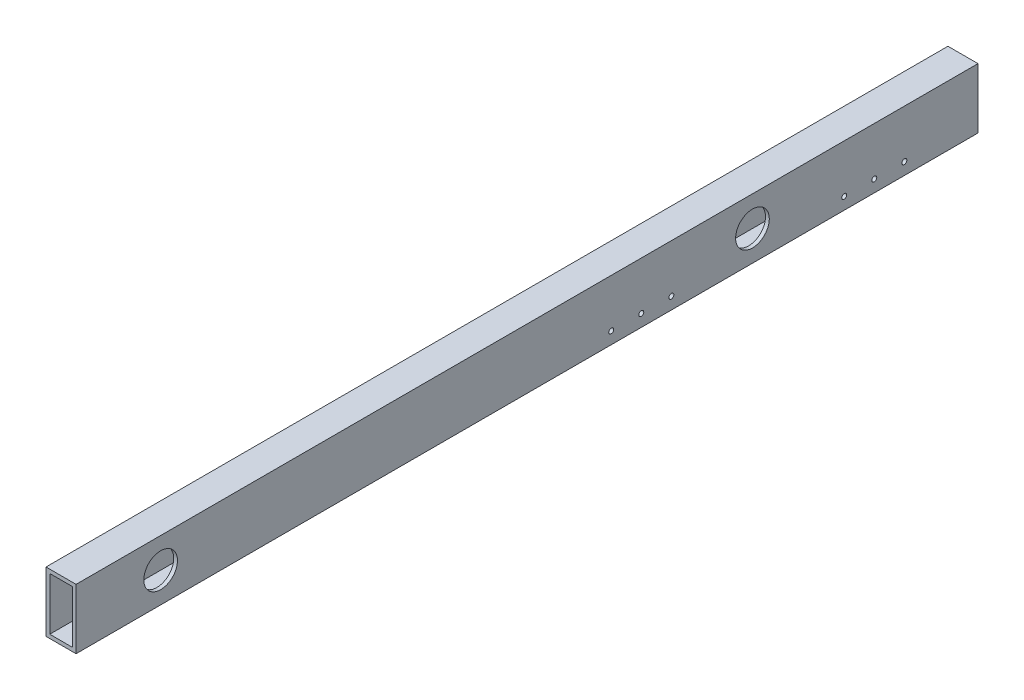
ISO-10303-21;
HEADER;
FILE_DESCRIPTION(('STEP AP214'),'2;1');
FILE_NAME('part.step','',(''),(''),'','','');
FILE_SCHEMA(('AUTOMOTIVE_DESIGN { 1 0 10303 214 1 1 1 1 }'));
ENDSEC;
DATA;
#1=APPLICATION_CONTEXT('core data for automotive mechanical design processes');
#2=APPLICATION_PROTOCOL_DEFINITION('international standard','automotive_design',2000,#1);
#3=PRODUCT_CONTEXT('',#1,'mechanical');
#4=PRODUCT('Part','Part','',(#3));
#5=PRODUCT_RELATED_PRODUCT_CATEGORY('part','',(#4));
#6=PRODUCT_DEFINITION_FORMATION('','',#4);
#7=PRODUCT_DEFINITION_CONTEXT('part definition',#1,'design');
#8=PRODUCT_DEFINITION('design','',#6,#7);
#9=PRODUCT_DEFINITION_SHAPE('','',#8);
#10=(LENGTH_UNIT() NAMED_UNIT(*) SI_UNIT(.MILLI.,.METRE.));
#11=(NAMED_UNIT(*) PLANE_ANGLE_UNIT() SI_UNIT($,.RADIAN.));
#12=(NAMED_UNIT(*) SI_UNIT($,.STERADIAN.) SOLID_ANGLE_UNIT());
#13=UNCERTAINTY_MEASURE_WITH_UNIT(LENGTH_MEASURE(1.E-05),#10,'distance_accuracy_value','');
#14=(GEOMETRIC_REPRESENTATION_CONTEXT(3) GLOBAL_UNCERTAINTY_ASSIGNED_CONTEXT((#13)) GLOBAL_UNIT_ASSIGNED_CONTEXT((#10,
#11,#12)) REPRESENTATION_CONTEXT('',''));
#15=CARTESIAN_POINT('',(0.,0.,0.));
#16=DIRECTION('',(0.,0.,1.));
#17=DIRECTION('',(1.,0.,0.));
#18=AXIS2_PLACEMENT_3D('',#15,#16,#17);
#19=CARTESIAN_POINT('',(0.,0.,762.));
#20=DIRECTION('',(0.,0.,1.));
#21=DIRECTION('',(1.,0.,0.));
#22=AXIS2_PLACEMENT_3D('',#19,#20,#21);
#23=PLANE('',#22);
#24=DIRECTION('',(0.,1.,0.));
#25=VECTOR('',#24,1.);
#26=CARTESIAN_POINT('',(12.7,25.4,762.));
#27=LINE('',#26,#25);
#28=CARTESIAN_POINT('',(12.7,-25.4,762.));
#29=VERTEX_POINT('',#28);
#30=CARTESIAN_POINT('',(12.7,25.4,762.));
#31=VERTEX_POINT('',#30);
#32=EDGE_CURVE('E157',#29,#31,#27,.T.);
#33=ORIENTED_EDGE('',*,*,#32,.T.);
#34=DIRECTION('',(-1.,0.,0.));
#35=VECTOR('',#34,1.);
#36=CARTESIAN_POINT('',(-12.7,25.4,762.));
#37=LINE('',#36,#35);
#38=CARTESIAN_POINT('',(-12.7,25.4,762.));
#39=VERTEX_POINT('',#38);
#40=EDGE_CURVE('E161',#31,#39,#37,.T.);
#41=ORIENTED_EDGE('',*,*,#40,.T.);
#42=DIRECTION('',(0.,-1.,0.));
#43=VECTOR('',#42,1.);
#44=CARTESIAN_POINT('',(-12.7,25.4,762.));
#45=LINE('',#44,#43);
#46=CARTESIAN_POINT('',(-12.7,-25.4,762.));
#47=VERTEX_POINT('',#46);
#48=EDGE_CURVE('E165',#39,#47,#45,.T.);
#49=ORIENTED_EDGE('',*,*,#48,.T.);
#50=DIRECTION('',(1.,0.,0.));
#51=VECTOR('',#50,1.);
#52=CARTESIAN_POINT('',(-12.7,-25.4,762.));
#53=LINE('',#52,#51);
#54=EDGE_CURVE('E168',#47,#29,#53,.T.);
#55=ORIENTED_EDGE('',*,*,#54,.T.);
#56=EDGE_LOOP('',(#33,#41,#49,#55));
#57=FACE_BOUND('',#56,.T.);
#58=DIRECTION('',(1.,0.,0.));
#59=VECTOR('',#58,1.);
#60=CARTESIAN_POINT('',(-9.525,-22.225,762.));
#61=LINE('',#60,#59);
#62=CARTESIAN_POINT('',(-9.525,-22.225,762.));
#63=VERTEX_POINT('',#62);
#64=CARTESIAN_POINT('',(9.52500000000002,-22.225,762.));
#65=VERTEX_POINT('',#64);
#66=EDGE_CURVE('E116',#63,#65,#61,.T.);
#67=ORIENTED_EDGE('',*,*,#66,.F.);
#68=DIRECTION('',(0.,-1.,0.));
#69=VECTOR('',#68,1.);
#70=CARTESIAN_POINT('',(-9.52500000000001,22.225,762.));
#71=LINE('',#70,#69);
#72=CARTESIAN_POINT('',(-9.52500000000001,22.225,762.));
#73=VERTEX_POINT('',#72);
#74=EDGE_CURVE('E107',#73,#63,#71,.T.);
#75=ORIENTED_EDGE('',*,*,#74,.F.);
#76=DIRECTION('',(-1.,0.,0.));
#77=VECTOR('',#76,1.);
#78=CARTESIAN_POINT('',(-9.52500000000001,22.225,762.));
#79=LINE('',#78,#77);
#80=CARTESIAN_POINT('',(9.52500000000001,22.225,762.));
#81=VERTEX_POINT('',#80);
#82=EDGE_CURVE('E133',#81,#73,#79,.T.);
#83=ORIENTED_EDGE('',*,*,#82,.F.);
#84=DIRECTION('',(0.,1.,0.));
#85=VECTOR('',#84,1.);
#86=CARTESIAN_POINT('',(9.52500000000001,22.225,762.));
#87=LINE('',#86,#85);
#88=EDGE_CURVE('E129',#65,#81,#87,.T.);
#89=ORIENTED_EDGE('',*,*,#88,.F.);
#90=EDGE_LOOP('',(#67,#75,#83,#89));
#91=FACE_BOUND('',#90,.T.);
#92=ADVANCED_FACE('F39',(#57,#91),#23,.T.);
#93=CARTESIAN_POINT('',(0.,0.,0.));
#94=DIRECTION('',(0.,0.,1.));
#95=DIRECTION('',(1.,0.,0.));
#96=AXIS2_PLACEMENT_3D('',#93,#94,#95);
#97=PLANE('',#96);
#98=DIRECTION('',(0.,1.,0.));
#99=VECTOR('',#98,1.);
#100=CARTESIAN_POINT('',(12.7,25.4,0.));
#101=LINE('',#100,#99);
#102=CARTESIAN_POINT('',(12.7,-25.4,0.));
#103=VERTEX_POINT('',#102);
#104=CARTESIAN_POINT('',(12.7,25.4,0.));
#105=VERTEX_POINT('',#104);
#106=EDGE_CURVE('E125',#103,#105,#101,.T.);
#107=ORIENTED_EDGE('',*,*,#106,.F.);
#108=DIRECTION('',(1.,0.,0.));
#109=VECTOR('',#108,1.);
#110=CARTESIAN_POINT('',(-12.7,-25.4,0.));
#111=LINE('',#110,#109);
#112=CARTESIAN_POINT('',(-12.7,-25.4,0.));
#113=VERTEX_POINT('',#112);
#114=EDGE_CURVE('E162',#113,#103,#111,.T.);
#115=ORIENTED_EDGE('',*,*,#114,.F.);
#116=DIRECTION('',(0.,-1.,0.));
#117=VECTOR('',#116,1.);
#118=CARTESIAN_POINT('',(-12.7,25.4,0.));
#119=LINE('',#118,#117);
#120=CARTESIAN_POINT('',(-12.7,25.4,0.));
#121=VERTEX_POINT('',#120);
#122=EDGE_CURVE('E178',#121,#113,#119,.T.);
#123=ORIENTED_EDGE('',*,*,#122,.F.);
#124=DIRECTION('',(-1.,0.,0.));
#125=VECTOR('',#124,1.);
#126=CARTESIAN_POINT('',(-12.7,25.4,0.));
#127=LINE('',#126,#125);
#128=EDGE_CURVE('E175',#105,#121,#127,.T.);
#129=ORIENTED_EDGE('',*,*,#128,.F.);
#130=EDGE_LOOP('',(#107,#115,#123,#129));
#131=FACE_BOUND('',#130,.T.);
#132=DIRECTION('',(0.,-1.,0.));
#133=VECTOR('',#132,1.);
#134=CARTESIAN_POINT('',(-9.52500000000001,22.225,0.));
#135=LINE('',#134,#133);
#136=CARTESIAN_POINT('',(-9.52500000000001,22.225,0.));
#137=VERTEX_POINT('',#136);
#138=CARTESIAN_POINT('',(-9.525,-22.225,0.));
#139=VERTEX_POINT('',#138);
#140=EDGE_CURVE('E65',#137,#139,#135,.T.);
#141=ORIENTED_EDGE('',*,*,#140,.T.);
#142=DIRECTION('',(1.,0.,0.));
#143=VECTOR('',#142,1.);
#144=CARTESIAN_POINT('',(-9.525,-22.225,0.));
#145=LINE('',#144,#143);
#146=CARTESIAN_POINT('',(9.52500000000002,-22.225,0.));
#147=VERTEX_POINT('',#146);
#148=EDGE_CURVE('E123',#139,#147,#145,.T.);
#149=ORIENTED_EDGE('',*,*,#148,.T.);
#150=DIRECTION('',(0.,1.,0.));
#151=VECTOR('',#150,1.);
#152=CARTESIAN_POINT('',(9.52500000000001,22.225,0.));
#153=LINE('',#152,#151);
#154=CARTESIAN_POINT('',(9.52500000000001,22.225,0.));
#155=VERTEX_POINT('',#154);
#156=EDGE_CURVE('E144',#147,#155,#153,.T.);
#157=ORIENTED_EDGE('',*,*,#156,.T.);
#158=DIRECTION('',(-1.,0.,0.));
#159=VECTOR('',#158,1.);
#160=CARTESIAN_POINT('',(-9.52500000000001,22.225,0.));
#161=LINE('',#160,#159);
#162=EDGE_CURVE('E117',#155,#137,#161,.T.);
#163=ORIENTED_EDGE('',*,*,#162,.T.);
#164=EDGE_LOOP('',(#141,#149,#157,#163));
#165=FACE_BOUND('',#164,.T.);
#166=ADVANCED_FACE('F347',(#131,#165),#97,.F.);
#167=CARTESIAN_POINT('',(12.7,25.4,762.));
#168=DIRECTION('',(-1.,0.,0.));
#169=DIRECTION('',(0.,0.,1.));
#170=AXIS2_PLACEMENT_3D('',#167,#168,#169);
#171=PLANE('',#170);
#172=CARTESIAN_POINT('',(12.7,-15.2400000000002,284.48));
#173=DIRECTION('',(1.,0.,0.));
#174=DIRECTION('',(0.,1.,0.));
#175=AXIS2_PLACEMENT_3D('',#172,#173,#174);
#176=CIRCLE('',#175,2.09549999999999);
#177=CARTESIAN_POINT('',(12.7,-13.1445000000002,284.48));
#178=VERTEX_POINT('',#177);
#179=EDGE_CURVE('E485',#178,#178,#176,.T.);
#180=ORIENTED_EDGE('',*,*,#179,.F.);
#181=EDGE_LOOP('',(#180));
#182=FACE_BOUND('',#181,.T.);
#183=CARTESIAN_POINT('',(12.7,-15.2400000000004,309.88));
#184=DIRECTION('',(1.,0.,0.));
#185=DIRECTION('',(0.,1.,0.));
#186=AXIS2_PLACEMENT_3D('',#183,#184,#185);
#187=CIRCLE('',#186,2.09549999999999);
#188=CARTESIAN_POINT('',(12.7,-13.1445000000004,309.88));
#189=VERTEX_POINT('',#188);
#190=EDGE_CURVE('E495',#189,#189,#187,.T.);
#191=ORIENTED_EDGE('',*,*,#190,.F.);
#192=EDGE_LOOP('',(#191));
#193=FACE_BOUND('',#192,.T.);
#194=CARTESIAN_POINT('',(12.7,-15.24,87.63));
#195=DIRECTION('',(1.,0.,0.));
#196=DIRECTION('',(0.,1.,0.));
#197=AXIS2_PLACEMENT_3D('',#194,#195,#196);
#198=CIRCLE('',#197,2.0955);
#199=CARTESIAN_POINT('',(12.7,-13.1445,87.63));
#200=VERTEX_POINT('',#199);
#201=EDGE_CURVE('E503',#200,#200,#198,.T.);
#202=ORIENTED_EDGE('',*,*,#201,.F.);
#203=EDGE_LOOP('',(#202));
#204=FACE_BOUND('',#203,.T.);
#205=CARTESIAN_POINT('',(12.7,-15.24,62.23));
#206=DIRECTION('',(1.,0.,0.));
#207=DIRECTION('',(0.,1.,0.));
#208=AXIS2_PLACEMENT_3D('',#205,#206,#207);
#209=CIRCLE('',#208,2.0955);
#210=CARTESIAN_POINT('',(12.7,-13.1445,62.23));
#211=VERTEX_POINT('',#210);
#212=EDGE_CURVE('E474',#211,#211,#209,.T.);
#213=ORIENTED_EDGE('',*,*,#212,.F.);
#214=EDGE_LOOP('',(#213));
#215=FACE_BOUND('',#214,.T.);
#216=CARTESIAN_POINT('',(12.7,-15.2400000000002,113.03));
#217=DIRECTION('',(1.,0.,0.));
#218=DIRECTION('',(0.,1.,0.));
#219=AXIS2_PLACEMENT_3D('',#216,#217,#218);
#220=CIRCLE('',#219,2.09549999999999);
#221=CARTESIAN_POINT('',(12.7,-13.1445000000002,113.03));
#222=VERTEX_POINT('',#221);
#223=EDGE_CURVE('E475',#222,#222,#220,.T.);
#224=ORIENTED_EDGE('',*,*,#223,.F.);
#225=EDGE_LOOP('',(#224));
#226=FACE_BOUND('',#225,.T.);
#227=CARTESIAN_POINT('',(12.7,-15.24,259.08));
#228=DIRECTION('',(1.,0.,0.));
#229=DIRECTION('',(0.,1.,0.));
#230=AXIS2_PLACEMENT_3D('',#227,#228,#229);
#231=CIRCLE('',#230,2.09549999999999);
#232=CARTESIAN_POINT('',(12.7,-13.1445,259.08));
#233=VERTEX_POINT('',#232);
#234=EDGE_CURVE('E494',#233,#233,#231,.T.);
#235=ORIENTED_EDGE('',*,*,#234,.F.);
#236=EDGE_LOOP('',(#235));
#237=FACE_BOUND('',#236,.T.);
#238=CARTESIAN_POINT('',(12.7,0.,190.549048410685));
#239=DIRECTION('',(1.,0.,0.));
#240=DIRECTION('',(0.,1.,0.));
#241=AXIS2_PLACEMENT_3D('',#238,#239,#240);
#242=CIRCLE('',#241,14.224);
#243=CARTESIAN_POINT('',(12.7,14.224,190.549048410685));
#244=VERTEX_POINT('',#243);
#245=EDGE_CURVE('E293',#244,#244,#242,.T.);
#246=ORIENTED_EDGE('',*,*,#245,.F.);
#247=EDGE_LOOP('',(#246));
#248=FACE_BOUND('',#247,.T.);
#249=CARTESIAN_POINT('',(12.7,0.,690.548048410685));
#250=DIRECTION('',(1.,0.,0.));
#251=DIRECTION('',(0.,1.,0.));
#252=AXIS2_PLACEMENT_3D('',#249,#250,#251);
#253=CIRCLE('',#252,14.2240000000001);
#254=CARTESIAN_POINT('',(12.7,14.224,690.548048410685));
#255=VERTEX_POINT('',#254);
#256=EDGE_CURVE('E297',#255,#255,#253,.T.);
#257=ORIENTED_EDGE('',*,*,#256,.F.);
#258=EDGE_LOOP('',(#257));
#259=FACE_BOUND('',#258,.T.);
#260=ORIENTED_EDGE('',*,*,#106,.T.);
#261=DIRECTION('',(0.,0.,-1.));
#262=VECTOR('',#261,1.);
#263=CARTESIAN_POINT('',(12.7,25.4,762.));
#264=LINE('',#263,#262);
#265=EDGE_CURVE('E11',#31,#105,#264,.T.);
#266=ORIENTED_EDGE('',*,*,#265,.F.);
#267=ORIENTED_EDGE('',*,*,#32,.F.);
#268=DIRECTION('',(0.,0.,-1.));
#269=VECTOR('',#268,1.);
#270=CARTESIAN_POINT('',(12.7,-25.4,762.));
#271=LINE('',#270,#269);
#272=EDGE_CURVE('E171',#29,#103,#271,.T.);
#273=ORIENTED_EDGE('',*,*,#272,.T.);
#274=EDGE_LOOP('',(#260,#266,#267,#273));
#275=FACE_BOUND('',#274,.T.);
#276=ADVANCED_FACE('F41',(#182,#193,#204,#215,#226,#237,#248,#259,#275),#171,.F.);
#277=CARTESIAN_POINT('',(-12.7,25.4,762.));
#278=DIRECTION('',(0.,-1.,0.));
#279=DIRECTION('',(0.,0.,-1.));
#280=AXIS2_PLACEMENT_3D('',#277,#278,#279);
#281=PLANE('',#280);
#282=ORIENTED_EDGE('',*,*,#128,.T.);
#283=DIRECTION('',(0.,0.,-1.));
#284=VECTOR('',#283,1.);
#285=CARTESIAN_POINT('',(-12.7,25.4,762.));
#286=LINE('',#285,#284);
#287=EDGE_CURVE('E49',#39,#121,#286,.T.);
#288=ORIENTED_EDGE('',*,*,#287,.F.);
#289=ORIENTED_EDGE('',*,*,#40,.F.);
#290=ORIENTED_EDGE('',*,*,#265,.T.);
#291=EDGE_LOOP('',(#282,#288,#289,#290));
#292=FACE_BOUND('',#291,.T.);
#293=ADVANCED_FACE('F334',(#292),#281,.F.);
#294=CARTESIAN_POINT('',(-12.7,25.4,762.));
#295=DIRECTION('',(1.,0.,0.));
#296=DIRECTION('',(0.,0.,-1.));
#297=AXIS2_PLACEMENT_3D('',#294,#295,#296);
#298=PLANE('',#297);
#299=CARTESIAN_POINT('',(-12.7,-15.2400000000002,284.48));
#300=DIRECTION('',(1.,0.,0.));
#301=DIRECTION('',(0.,0.,-1.));
#302=AXIS2_PLACEMENT_3D('',#299,#300,#301);
#303=CIRCLE('',#302,2.09549999999999);
#304=CARTESIAN_POINT('',(-12.7,-15.2400000000002,282.3845));
#305=VERTEX_POINT('',#304);
#306=EDGE_CURVE('E489',#305,#305,#303,.F.);
#307=ORIENTED_EDGE('',*,*,#306,.F.);
#308=EDGE_LOOP('',(#307));
#309=FACE_BOUND('',#308,.T.);
#310=CARTESIAN_POINT('',(-12.7,-15.2400000000004,309.88));
#311=DIRECTION('',(1.,0.,0.));
#312=DIRECTION('',(0.,0.,-1.));
#313=AXIS2_PLACEMENT_3D('',#310,#311,#312);
#314=CIRCLE('',#313,2.09549999999999);
#315=CARTESIAN_POINT('',(-12.7,-15.2400000000004,307.7845));
#316=VERTEX_POINT('',#315);
#317=EDGE_CURVE('E490',#316,#316,#314,.F.);
#318=ORIENTED_EDGE('',*,*,#317,.F.);
#319=EDGE_LOOP('',(#318));
#320=FACE_BOUND('',#319,.T.);
#321=CARTESIAN_POINT('',(-12.7,-15.24,87.63));
#322=DIRECTION('',(1.,0.,0.));
#323=DIRECTION('',(0.,0.,-1.));
#324=AXIS2_PLACEMENT_3D('',#321,#322,#323);
#325=CIRCLE('',#324,2.0955);
#326=CARTESIAN_POINT('',(-12.7,-15.24,85.5345));
#327=VERTEX_POINT('',#326);
#328=EDGE_CURVE('E499',#327,#327,#325,.F.);
#329=ORIENTED_EDGE('',*,*,#328,.F.);
#330=EDGE_LOOP('',(#329));
#331=FACE_BOUND('',#330,.T.);
#332=CARTESIAN_POINT('',(-12.7,-15.24,62.23));
#333=DIRECTION('',(1.,0.,0.));
#334=DIRECTION('',(0.,0.,-1.));
#335=AXIS2_PLACEMENT_3D('',#332,#333,#334);
#336=CIRCLE('',#335,2.0955);
#337=CARTESIAN_POINT('',(-12.7,-15.24,60.1345));
#338=VERTEX_POINT('',#337);
#339=EDGE_CURVE('E480',#338,#338,#336,.F.);
#340=ORIENTED_EDGE('',*,*,#339,.F.);
#341=EDGE_LOOP('',(#340));
#342=FACE_BOUND('',#341,.T.);
#343=CARTESIAN_POINT('',(-12.7,-15.2400000000002,113.03));
#344=DIRECTION('',(1.,0.,0.));
#345=DIRECTION('',(0.,0.,-1.));
#346=AXIS2_PLACEMENT_3D('',#343,#344,#345);
#347=CIRCLE('',#346,2.09549999999999);
#348=CARTESIAN_POINT('',(-12.7,-15.2400000000002,110.9345));
#349=VERTEX_POINT('',#348);
#350=EDGE_CURVE('E471',#349,#349,#347,.F.);
#351=ORIENTED_EDGE('',*,*,#350,.F.);
#352=EDGE_LOOP('',(#351));
#353=FACE_BOUND('',#352,.T.);
#354=CARTESIAN_POINT('',(-12.7,-15.24,259.08));
#355=DIRECTION('',(1.,0.,0.));
#356=DIRECTION('',(0.,0.,-1.));
#357=AXIS2_PLACEMENT_3D('',#354,#355,#356);
#358=CIRCLE('',#357,2.09549999999999);
#359=CARTESIAN_POINT('',(-12.7,-15.24,256.9845));
#360=VERTEX_POINT('',#359);
#361=EDGE_CURVE('E208',#360,#360,#358,.F.);
#362=ORIENTED_EDGE('',*,*,#361,.F.);
#363=EDGE_LOOP('',(#362));
#364=FACE_BOUND('',#363,.T.);
#365=CARTESIAN_POINT('',(-12.7,0.,190.549048410685));
#366=DIRECTION('',(1.,0.,0.));
#367=DIRECTION('',(0.,0.,-1.));
#368=AXIS2_PLACEMENT_3D('',#365,#366,#367);
#369=CIRCLE('',#368,14.224);
#370=CARTESIAN_POINT('',(-12.7,0.,176.325048410685));
#371=VERTEX_POINT('',#370);
#372=EDGE_CURVE('E198',#371,#371,#369,.F.);
#373=ORIENTED_EDGE('',*,*,#372,.F.);
#374=EDGE_LOOP('',(#373));
#375=FACE_BOUND('',#374,.T.);
#376=CARTESIAN_POINT('',(-12.7,0.,690.548048410685));
#377=DIRECTION('',(1.,0.,0.));
#378=DIRECTION('',(0.,0.,-1.));
#379=AXIS2_PLACEMENT_3D('',#376,#377,#378);
#380=CIRCLE('',#379,14.2240000000001);
#381=CARTESIAN_POINT('',(-12.7,0.,676.324048410685));
#382=VERTEX_POINT('',#381);
#383=EDGE_CURVE('E292',#382,#382,#380,.F.);
#384=ORIENTED_EDGE('',*,*,#383,.F.);
#385=EDGE_LOOP('',(#384));
#386=FACE_BOUND('',#385,.T.);
#387=ORIENTED_EDGE('',*,*,#122,.T.);
#388=DIRECTION('',(0.,0.,-1.));
#389=VECTOR('',#388,1.);
#390=CARTESIAN_POINT('',(-12.7,-25.4,762.));
#391=LINE('',#390,#389);
#392=EDGE_CURVE('E186',#47,#113,#391,.T.);
#393=ORIENTED_EDGE('',*,*,#392,.F.);
#394=ORIENTED_EDGE('',*,*,#48,.F.);
#395=ORIENTED_EDGE('',*,*,#287,.T.);
#396=EDGE_LOOP('',(#387,#393,#394,#395));
#397=FACE_BOUND('',#396,.T.);
#398=ADVANCED_FACE('F331',(#309,#320,#331,#342,#353,#364,#375,#386,#397),#298,.F.);
#399=CARTESIAN_POINT('',(-12.7,-25.4,762.));
#400=DIRECTION('',(0.,1.,0.));
#401=DIRECTION('',(0.,0.,1.));
#402=AXIS2_PLACEMENT_3D('',#399,#400,#401);
#403=PLANE('',#402);
#404=CARTESIAN_POINT('',(2.53999999999982,-25.4,289.56));
#405=DIRECTION('',(0.,-1.,0.));
#406=DIRECTION('',(0.,0.,-1.));
#407=AXIS2_PLACEMENT_3D('',#404,#405,#406);
#408=CIRCLE('',#407,2.09549999999999);
#409=CARTESIAN_POINT('',(2.53999999999982,-25.4,287.4645));
#410=VERTEX_POINT('',#409);
#411=EDGE_CURVE('E253',#410,#410,#408,.T.);
#412=ORIENTED_EDGE('',*,*,#411,.F.);
#413=EDGE_LOOP('',(#412));
#414=FACE_BOUND('',#413,.T.);
#415=CARTESIAN_POINT('',(2.53999999999973,-25.4,314.96));
#416=DIRECTION('',(0.,-1.,0.));
#417=DIRECTION('',(0.,0.,-1.));
#418=AXIS2_PLACEMENT_3D('',#415,#416,#417);
#419=CIRCLE('',#418,2.09549999999999);
#420=CARTESIAN_POINT('',(2.53999999999973,-25.4,312.8645));
#421=VERTEX_POINT('',#420);
#422=EDGE_CURVE('E263',#421,#421,#419,.T.);
#423=ORIENTED_EDGE('',*,*,#422,.F.);
#424=EDGE_LOOP('',(#423));
#425=FACE_BOUND('',#424,.T.);
#426=CARTESIAN_POINT('',(-2.5400000000001,-25.4,264.16));
#427=DIRECTION('',(0.,-1.,0.));
#428=DIRECTION('',(0.,0.,1.));
#429=AXIS2_PLACEMENT_3D('',#426,#427,#428);
#430=CIRCLE('',#429,2.09549999999999);
#431=CARTESIAN_POINT('',(-2.5400000000001,-25.4,266.2555));
#432=VERTEX_POINT('',#431);
#433=EDGE_CURVE('E271',#432,#432,#430,.T.);
#434=ORIENTED_EDGE('',*,*,#433,.F.);
#435=EDGE_LOOP('',(#434));
#436=FACE_BOUND('',#435,.T.);
#437=CARTESIAN_POINT('',(-2.53999999999987,-25.4,289.56));
#438=DIRECTION('',(0.,-1.,0.));
#439=DIRECTION('',(0.,0.,1.));
#440=AXIS2_PLACEMENT_3D('',#437,#438,#439);
#441=CIRCLE('',#440,2.09549999999999);
#442=CARTESIAN_POINT('',(-2.53999999999987,-25.4,291.6555));
#443=VERTEX_POINT('',#442);
#444=EDGE_CURVE('E252',#443,#443,#441,.T.);
#445=ORIENTED_EDGE('',*,*,#444,.F.);
#446=EDGE_LOOP('',(#445));
#447=FACE_BOUND('',#446,.T.);
#448=CARTESIAN_POINT('',(-2.53999999999963,-25.4,314.96));
#449=DIRECTION('',(0.,-1.,0.));
#450=DIRECTION('',(0.,0.,1.));
#451=AXIS2_PLACEMENT_3D('',#448,#449,#450);
#452=CIRCLE('',#451,2.09549999999999);
#453=CARTESIAN_POINT('',(-2.53999999999963,-25.4,317.0555));
#454=VERTEX_POINT('',#453);
#455=EDGE_CURVE('E244',#454,#454,#452,.T.);
#456=ORIENTED_EDGE('',*,*,#455,.F.);
#457=EDGE_LOOP('',(#456));
#458=FACE_BOUND('',#457,.T.);
#459=CARTESIAN_POINT('',(2.53999999999991,-25.4,264.16));
#460=DIRECTION('',(0.,-1.,0.));
#461=DIRECTION('',(0.,0.,-1.));
#462=AXIS2_PLACEMENT_3D('',#459,#460,#461);
#463=CIRCLE('',#462,2.09549999999999);
#464=CARTESIAN_POINT('',(2.53999999999991,-25.4,262.0645));
#465=VERTEX_POINT('',#464);
#466=EDGE_CURVE('E262',#465,#465,#463,.T.);
#467=ORIENTED_EDGE('',*,*,#466,.F.);
#468=EDGE_LOOP('',(#467));
#469=FACE_BOUND('',#468,.T.);
#470=ORIENTED_EDGE('',*,*,#114,.T.);
#471=ORIENTED_EDGE('',*,*,#272,.F.);
#472=ORIENTED_EDGE('',*,*,#54,.F.);
#473=ORIENTED_EDGE('',*,*,#392,.T.);
#474=EDGE_LOOP('',(#470,#471,#472,#473));
#475=FACE_BOUND('',#474,.T.);
#476=ADVANCED_FACE('F318',(#414,#425,#436,#447,#458,#469,#475),#403,.F.);
#477=CARTESIAN_POINT('',(-9.52500000000001,22.225,762.));
#478=DIRECTION('',(1.,0.,0.));
#479=DIRECTION('',(0.,1.,0.));
#480=AXIS2_PLACEMENT_3D('',#477,#478,#479);
#481=PLANE('',#480);
#482=CARTESIAN_POINT('',(-9.525,-15.2400000000002,284.48));
#483=DIRECTION('',(1.,0.,0.));
#484=DIRECTION('',(0.,1.,0.));
#485=AXIS2_PLACEMENT_3D('',#482,#483,#484);
#486=CIRCLE('',#485,2.09549999999999);
#487=CARTESIAN_POINT('',(-9.525,-13.1445000000002,284.48));
#488=VERTEX_POINT('',#487);
#489=EDGE_CURVE('E240',#488,#488,#486,.T.);
#490=ORIENTED_EDGE('',*,*,#489,.F.);
#491=EDGE_LOOP('',(#490));
#492=FACE_BOUND('',#491,.T.);
#493=CARTESIAN_POINT('',(-9.525,-15.2400000000004,309.88));
#494=DIRECTION('',(1.,0.,0.));
#495=DIRECTION('',(0.,1.,0.));
#496=AXIS2_PLACEMENT_3D('',#493,#494,#495);
#497=CIRCLE('',#496,2.09549999999999);
#498=CARTESIAN_POINT('',(-9.525,-13.1445000000004,309.88));
#499=VERTEX_POINT('',#498);
#500=EDGE_CURVE('E226',#499,#499,#497,.T.);
#501=ORIENTED_EDGE('',*,*,#500,.F.);
#502=EDGE_LOOP('',(#501));
#503=FACE_BOUND('',#502,.T.);
#504=CARTESIAN_POINT('',(-9.525,-15.24,87.63));
#505=DIRECTION('',(1.,0.,0.));
#506=DIRECTION('',(0.,1.,0.));
#507=AXIS2_PLACEMENT_3D('',#504,#505,#506);
#508=CIRCLE('',#507,2.0955);
#509=CARTESIAN_POINT('',(-9.525,-13.1445,87.63));
#510=VERTEX_POINT('',#509);
#511=EDGE_CURVE('E222',#510,#510,#508,.T.);
#512=ORIENTED_EDGE('',*,*,#511,.F.);
#513=EDGE_LOOP('',(#512));
#514=FACE_BOUND('',#513,.T.);
#515=CARTESIAN_POINT('',(-9.525,-15.24,62.23));
#516=DIRECTION('',(1.,0.,0.));
#517=DIRECTION('',(0.,1.,0.));
#518=AXIS2_PLACEMENT_3D('',#515,#516,#517);
#519=CIRCLE('',#518,2.0955);
#520=CARTESIAN_POINT('',(-9.525,-13.1445,62.23));
#521=VERTEX_POINT('',#520);
#522=EDGE_CURVE('E218',#521,#521,#519,.T.);
#523=ORIENTED_EDGE('',*,*,#522,.F.);
#524=EDGE_LOOP('',(#523));
#525=FACE_BOUND('',#524,.T.);
#526=CARTESIAN_POINT('',(-9.525,-15.2400000000002,113.03));
#527=DIRECTION('',(1.,0.,0.));
#528=DIRECTION('',(0.,1.,0.));
#529=AXIS2_PLACEMENT_3D('',#526,#527,#528);
#530=CIRCLE('',#529,2.09549999999999);
#531=CARTESIAN_POINT('',(-9.525,-13.1445000000002,113.03));
#532=VERTEX_POINT('',#531);
#533=EDGE_CURVE('E213',#532,#532,#530,.T.);
#534=ORIENTED_EDGE('',*,*,#533,.F.);
#535=EDGE_LOOP('',(#534));
#536=FACE_BOUND('',#535,.T.);
#537=CARTESIAN_POINT('',(-9.525,-15.24,259.08));
#538=DIRECTION('',(1.,0.,0.));
#539=DIRECTION('',(0.,1.,0.));
#540=AXIS2_PLACEMENT_3D('',#537,#538,#539);
#541=CIRCLE('',#540,2.09549999999999);
#542=CARTESIAN_POINT('',(-9.525,-13.1445,259.08));
#543=VERTEX_POINT('',#542);
#544=EDGE_CURVE('E207',#543,#543,#541,.T.);
#545=ORIENTED_EDGE('',*,*,#544,.F.);
#546=EDGE_LOOP('',(#545));
#547=FACE_BOUND('',#546,.T.);
#548=CARTESIAN_POINT('',(-9.52500000000001,0.,190.549048410685));
#549=DIRECTION('',(1.,0.,0.));
#550=DIRECTION('',(0.,1.,0.));
#551=AXIS2_PLACEMENT_3D('',#548,#549,#550);
#552=CIRCLE('',#551,14.224);
#553=CARTESIAN_POINT('',(-9.52500000000001,14.224,190.549048410685));
#554=VERTEX_POINT('',#553);
#555=EDGE_CURVE('E141',#554,#554,#552,.T.);
#556=ORIENTED_EDGE('',*,*,#555,.F.);
#557=EDGE_LOOP('',(#556));
#558=FACE_BOUND('',#557,.T.);
#559=CARTESIAN_POINT('',(-9.52500000000001,0.,690.548048410685));
#560=DIRECTION('',(1.,0.,0.));
#561=DIRECTION('',(0.,1.,0.));
#562=AXIS2_PLACEMENT_3D('',#559,#560,#561);
#563=CIRCLE('',#562,14.2240000000001);
#564=CARTESIAN_POINT('',(-9.52500000000001,14.224,690.548048410685));
#565=VERTEX_POINT('',#564);
#566=EDGE_CURVE('E197',#565,#565,#563,.T.);
#567=ORIENTED_EDGE('',*,*,#566,.F.);
#568=EDGE_LOOP('',(#567));
#569=FACE_BOUND('',#568,.T.);
#570=ORIENTED_EDGE('',*,*,#140,.F.);
#571=DIRECTION('',(0.,0.,-1.));
#572=VECTOR('',#571,1.);
#573=CARTESIAN_POINT('',(-9.52500000000001,22.225,762.));
#574=LINE('',#573,#572);
#575=EDGE_CURVE('E111',#73,#137,#574,.T.);
#576=ORIENTED_EDGE('',*,*,#575,.F.);
#577=ORIENTED_EDGE('',*,*,#74,.T.);
#578=DIRECTION('',(0.,0.,-1.));
#579=VECTOR('',#578,1.);
#580=CARTESIAN_POINT('',(-9.525,-22.225,762.));
#581=LINE('',#580,#579);
#582=EDGE_CURVE('E110',#63,#139,#581,.T.);
#583=ORIENTED_EDGE('',*,*,#582,.T.);
#584=EDGE_LOOP('',(#570,#576,#577,#583));
#585=FACE_BOUND('',#584,.T.);
#586=ADVANCED_FACE('F109',(#492,#503,#514,#525,#536,#547,#558,#569,#585),#481,.T.);
#587=CARTESIAN_POINT('',(-9.525,-22.225,762.));
#588=DIRECTION('',(0.,1.,0.));
#589=DIRECTION('',(-1.,0.,0.));
#590=AXIS2_PLACEMENT_3D('',#587,#588,#589);
#591=PLANE('',#590);
#592=CARTESIAN_POINT('',(2.53999999999982,-22.225,289.56));
#593=DIRECTION('',(0.,1.,0.));
#594=DIRECTION('',(-1.,0.,0.));
#595=AXIS2_PLACEMENT_3D('',#592,#593,#594);
#596=CIRCLE('',#595,2.09549999999999);
#597=CARTESIAN_POINT('',(0.444499999999827,-22.225,289.56));
#598=VERTEX_POINT('',#597);
#599=EDGE_CURVE('E257',#598,#598,#596,.F.);
#600=ORIENTED_EDGE('',*,*,#599,.T.);
#601=EDGE_LOOP('',(#600));
#602=FACE_BOUND('',#601,.T.);
#603=CARTESIAN_POINT('',(2.53999999999973,-22.225,314.96));
#604=DIRECTION('',(0.,1.,0.));
#605=DIRECTION('',(-1.,0.,0.));
#606=AXIS2_PLACEMENT_3D('',#603,#604,#605);
#607=CIRCLE('',#606,2.09549999999999);
#608=CARTESIAN_POINT('',(0.444499999999737,-22.225,314.96));
#609=VERTEX_POINT('',#608);
#610=EDGE_CURVE('E258',#609,#609,#607,.F.);
#611=ORIENTED_EDGE('',*,*,#610,.T.);
#612=EDGE_LOOP('',(#611));
#613=FACE_BOUND('',#612,.T.);
#614=CARTESIAN_POINT('',(-2.5400000000001,-22.225,264.16));
#615=DIRECTION('',(0.,1.,0.));
#616=DIRECTION('',(-1.,0.,0.));
#617=AXIS2_PLACEMENT_3D('',#614,#615,#616);
#618=CIRCLE('',#617,2.09549999999999);
#619=CARTESIAN_POINT('',(-4.63550000000009,-22.225,264.16));
#620=VERTEX_POINT('',#619);
#621=EDGE_CURVE('E267',#620,#620,#618,.F.);
#622=ORIENTED_EDGE('',*,*,#621,.T.);
#623=EDGE_LOOP('',(#622));
#624=FACE_BOUND('',#623,.T.);
#625=CARTESIAN_POINT('',(-2.53999999999987,-22.225,289.56));
#626=DIRECTION('',(0.,1.,0.));
#627=DIRECTION('',(-1.,0.,0.));
#628=AXIS2_PLACEMENT_3D('',#625,#626,#627);
#629=CIRCLE('',#628,2.09549999999999);
#630=CARTESIAN_POINT('',(-4.63549999999986,-22.225,289.56));
#631=VERTEX_POINT('',#630);
#632=EDGE_CURVE('E275',#631,#631,#629,.F.);
#633=ORIENTED_EDGE('',*,*,#632,.T.);
#634=EDGE_LOOP('',(#633));
#635=FACE_BOUND('',#634,.T.);
#636=CARTESIAN_POINT('',(-2.53999999999963,-22.225,314.96));
#637=DIRECTION('',(0.,1.,0.));
#638=DIRECTION('',(-1.,0.,0.));
#639=AXIS2_PLACEMENT_3D('',#636,#637,#638);
#640=CIRCLE('',#639,2.09549999999999);
#641=CARTESIAN_POINT('',(-4.63549999999962,-22.225,314.96));
#642=VERTEX_POINT('',#641);
#643=EDGE_CURVE('E248',#642,#642,#640,.F.);
#644=ORIENTED_EDGE('',*,*,#643,.T.);
#645=EDGE_LOOP('',(#644));
#646=FACE_BOUND('',#645,.T.);
#647=CARTESIAN_POINT('',(2.53999999999991,-22.225,264.16));
#648=DIRECTION('',(0.,1.,0.));
#649=DIRECTION('',(-1.,0.,0.));
#650=AXIS2_PLACEMENT_3D('',#647,#648,#649);
#651=CIRCLE('',#650,2.09549999999999);
#652=CARTESIAN_POINT('',(0.444499999999914,-22.225,264.16));
#653=VERTEX_POINT('',#652);
#654=EDGE_CURVE('E288',#653,#653,#651,.F.);
#655=ORIENTED_EDGE('',*,*,#654,.T.);
#656=EDGE_LOOP('',(#655));
#657=FACE_BOUND('',#656,.T.);
#658=ORIENTED_EDGE('',*,*,#148,.F.);
#659=ORIENTED_EDGE('',*,*,#582,.F.);
#660=ORIENTED_EDGE('',*,*,#66,.T.);
#661=DIRECTION('',(0.,0.,-1.));
#662=VECTOR('',#661,1.);
#663=CARTESIAN_POINT('',(9.52500000000002,-22.225,762.));
#664=LINE('',#663,#662);
#665=EDGE_CURVE('E126',#65,#147,#664,.T.);
#666=ORIENTED_EDGE('',*,*,#665,.T.);
#667=EDGE_LOOP('',(#658,#659,#660,#666));
#668=FACE_BOUND('',#667,.T.);
#669=ADVANCED_FACE('F120',(#602,#613,#624,#635,#646,#657,#668),#591,.T.);
#670=CARTESIAN_POINT('',(9.52500000000001,22.225,762.));
#671=DIRECTION('',(-1.,0.,0.));
#672=DIRECTION('',(0.,-1.,0.));
#673=AXIS2_PLACEMENT_3D('',#670,#671,#672);
#674=PLANE('',#673);
#675=CARTESIAN_POINT('',(9.52500000000002,-15.2400000000002,284.48));
#676=DIRECTION('',(-1.,0.,0.));
#677=DIRECTION('',(0.,-1.,0.));
#678=AXIS2_PLACEMENT_3D('',#675,#676,#677);
#679=CIRCLE('',#678,2.09549999999999);
#680=CARTESIAN_POINT('',(9.52500000000002,-17.3355000000002,284.48));
#681=VERTEX_POINT('',#680);
#682=EDGE_CURVE('E43',#681,#681,#679,.T.);
#683=ORIENTED_EDGE('',*,*,#682,.F.);
#684=EDGE_LOOP('',(#683));
#685=FACE_BOUND('',#684,.T.);
#686=CARTESIAN_POINT('',(9.52500000000002,-15.2400000000004,309.88));
#687=DIRECTION('',(-1.,0.,0.));
#688=DIRECTION('',(0.,-1.,0.));
#689=AXIS2_PLACEMENT_3D('',#686,#687,#688);
#690=CIRCLE('',#689,2.09549999999999);
#691=CARTESIAN_POINT('',(9.52500000000002,-17.3355000000004,309.88));
#692=VERTEX_POINT('',#691);
#693=EDGE_CURVE('E223',#692,#692,#690,.T.);
#694=ORIENTED_EDGE('',*,*,#693,.F.);
#695=EDGE_LOOP('',(#694));
#696=FACE_BOUND('',#695,.T.);
#697=CARTESIAN_POINT('',(9.52500000000002,-15.24,87.63));
#698=DIRECTION('',(-1.,0.,0.));
#699=DIRECTION('',(0.,-1.,0.));
#700=AXIS2_PLACEMENT_3D('',#697,#698,#699);
#701=CIRCLE('',#700,2.0955);
#702=CARTESIAN_POINT('',(9.52500000000002,-17.3355,87.63));
#703=VERTEX_POINT('',#702);
#704=EDGE_CURVE('E219',#703,#703,#701,.T.);
#705=ORIENTED_EDGE('',*,*,#704,.F.);
#706=EDGE_LOOP('',(#705));
#707=FACE_BOUND('',#706,.T.);
#708=CARTESIAN_POINT('',(9.52500000000002,-15.24,62.23));
#709=DIRECTION('',(-1.,0.,0.));
#710=DIRECTION('',(0.,-1.,0.));
#711=AXIS2_PLACEMENT_3D('',#708,#709,#710);
#712=CIRCLE('',#711,2.0955);
#713=CARTESIAN_POINT('',(9.52500000000002,-17.3355,62.23));
#714=VERTEX_POINT('',#713);
#715=EDGE_CURVE('E214',#714,#714,#712,.T.);
#716=ORIENTED_EDGE('',*,*,#715,.F.);
#717=EDGE_LOOP('',(#716));
#718=FACE_BOUND('',#717,.T.);
#719=CARTESIAN_POINT('',(9.52500000000002,-15.2400000000002,113.03));
#720=DIRECTION('',(-1.,0.,0.));
#721=DIRECTION('',(0.,-1.,0.));
#722=AXIS2_PLACEMENT_3D('',#719,#720,#721);
#723=CIRCLE('',#722,2.09549999999999);
#724=CARTESIAN_POINT('',(9.52500000000002,-17.3355000000002,113.03));
#725=VERTEX_POINT('',#724);
#726=EDGE_CURVE('E209',#725,#725,#723,.T.);
#727=ORIENTED_EDGE('',*,*,#726,.F.);
#728=EDGE_LOOP('',(#727));
#729=FACE_BOUND('',#728,.T.);
#730=CARTESIAN_POINT('',(9.52500000000002,-15.24,259.08));
#731=DIRECTION('',(-1.,0.,0.));
#732=DIRECTION('',(0.,-1.,0.));
#733=AXIS2_PLACEMENT_3D('',#730,#731,#732);
#734=CIRCLE('',#733,2.09549999999999);
#735=CARTESIAN_POINT('',(9.52500000000002,-17.3355,259.08));
#736=VERTEX_POINT('',#735);
#737=EDGE_CURVE('E203',#736,#736,#734,.T.);
#738=ORIENTED_EDGE('',*,*,#737,.F.);
#739=EDGE_LOOP('',(#738));
#740=FACE_BOUND('',#739,.T.);
#741=CARTESIAN_POINT('',(9.52500000000001,0.,190.549048410685));
#742=DIRECTION('',(-1.,0.,0.));
#743=DIRECTION('',(0.,-1.,0.));
#744=AXIS2_PLACEMENT_3D('',#741,#742,#743);
#745=CIRCLE('',#744,14.224);
#746=CARTESIAN_POINT('',(9.52500000000002,-14.224,190.549048410685));
#747=VERTEX_POINT('',#746);
#748=EDGE_CURVE('E199',#747,#747,#745,.T.);
#749=ORIENTED_EDGE('',*,*,#748,.F.);
#750=EDGE_LOOP('',(#749));
#751=FACE_BOUND('',#750,.T.);
#752=CARTESIAN_POINT('',(9.52500000000001,0.,690.548048410685));
#753=DIRECTION('',(-1.,0.,0.));
#754=DIRECTION('',(0.,-1.,0.));
#755=AXIS2_PLACEMENT_3D('',#752,#753,#754);
#756=CIRCLE('',#755,14.2240000000001);
#757=CARTESIAN_POINT('',(9.52500000000002,-14.2240000000001,690.548048410685));
#758=VERTEX_POINT('',#757);
#759=EDGE_CURVE('E193',#758,#758,#756,.T.);
#760=ORIENTED_EDGE('',*,*,#759,.F.);
#761=EDGE_LOOP('',(#760));
#762=FACE_BOUND('',#761,.T.);
#763=ORIENTED_EDGE('',*,*,#156,.F.);
#764=ORIENTED_EDGE('',*,*,#665,.F.);
#765=ORIENTED_EDGE('',*,*,#88,.T.);
#766=DIRECTION('',(0.,0.,-1.));
#767=VECTOR('',#766,1.);
#768=CARTESIAN_POINT('',(9.52500000000001,22.225,762.));
#769=LINE('',#768,#767);
#770=EDGE_CURVE('E57',#81,#155,#769,.T.);
#771=ORIENTED_EDGE('',*,*,#770,.T.);
#772=EDGE_LOOP('',(#763,#764,#765,#771));
#773=FACE_BOUND('',#772,.T.);
#774=ADVANCED_FACE('F391',(#685,#696,#707,#718,#729,#740,#751,#762,#773),#674,.T.);
#775=CARTESIAN_POINT('',(-9.52500000000001,22.225,762.));
#776=DIRECTION('',(0.,-1.,0.));
#777=DIRECTION('',(1.,0.,0.));
#778=AXIS2_PLACEMENT_3D('',#775,#776,#777);
#779=PLANE('',#778);
#780=ORIENTED_EDGE('',*,*,#162,.F.);
#781=ORIENTED_EDGE('',*,*,#770,.F.);
#782=ORIENTED_EDGE('',*,*,#82,.T.);
#783=ORIENTED_EDGE('',*,*,#575,.T.);
#784=EDGE_LOOP('',(#780,#781,#782,#783));
#785=FACE_BOUND('',#784,.T.);
#786=ADVANCED_FACE('F396',(#785),#779,.T.);
#787=CARTESIAN_POINT('',(-52.9315474223899,0.,690.548048410685));
#788=DIRECTION('',(1.,0.,0.));
#789=DIRECTION('',(0.,1.,0.));
#790=AXIS2_PLACEMENT_3D('',#787,#788,#789);
#791=CYLINDRICAL_SURFACE('',#790,14.2240000000001);
#792=ORIENTED_EDGE('',*,*,#759,.T.);
#793=EDGE_LOOP('',(#792));
#794=FACE_BOUND('',#793,.T.);
#795=ORIENTED_EDGE('',*,*,#256,.T.);
#796=EDGE_LOOP('',(#795));
#797=FACE_BOUND('',#796,.T.);
#798=ADVANCED_FACE('F328',(#794,#797),#791,.F.);
#799=CARTESIAN_POINT('',(-52.9315474223899,0.,190.549048410685));
#800=DIRECTION('',(1.,0.,0.));
#801=DIRECTION('',(0.,1.,0.));
#802=AXIS2_PLACEMENT_3D('',#799,#800,#801);
#803=CYLINDRICAL_SURFACE('',#802,14.224);
#804=ORIENTED_EDGE('',*,*,#748,.T.);
#805=EDGE_LOOP('',(#804));
#806=FACE_BOUND('',#805,.T.);
#807=ORIENTED_EDGE('',*,*,#245,.T.);
#808=EDGE_LOOP('',(#807));
#809=FACE_BOUND('',#808,.T.);
#810=ADVANCED_FACE('F326',(#806,#809),#803,.F.);
#811=ORIENTED_EDGE('',*,*,#566,.T.);
#812=EDGE_LOOP('',(#811));
#813=FACE_BOUND('',#812,.T.);
#814=ORIENTED_EDGE('',*,*,#383,.T.);
#815=EDGE_LOOP('',(#814));
#816=FACE_BOUND('',#815,.T.);
#817=ADVANCED_FACE('F323',(#813,#816),#791,.F.);
#818=ORIENTED_EDGE('',*,*,#555,.T.);
#819=EDGE_LOOP('',(#818));
#820=FACE_BOUND('',#819,.T.);
#821=ORIENTED_EDGE('',*,*,#372,.T.);
#822=EDGE_LOOP('',(#821));
#823=FACE_BOUND('',#822,.T.);
#824=ADVANCED_FACE('F313',(#820,#823),#803,.F.);
#825=CARTESIAN_POINT('',(2.53999999999991,-16.2980309600944,264.16));
#826=DIRECTION('',(0.,-1.,0.));
#827=DIRECTION('',(0.,0.,-1.));
#828=AXIS2_PLACEMENT_3D('',#825,#826,#827);
#829=CYLINDRICAL_SURFACE('',#828,2.09549999999999);
#830=ORIENTED_EDGE('',*,*,#466,.T.);
#831=EDGE_LOOP('',(#830));
#832=FACE_BOUND('',#831,.T.);
#833=ORIENTED_EDGE('',*,*,#654,.F.);
#834=EDGE_LOOP('',(#833));
#835=FACE_BOUND('',#834,.T.);
#836=ADVANCED_FACE('F383',(#832,#835),#829,.F.);
#837=CARTESIAN_POINT('',(-2.53999999999963,-16.2980309600944,314.96));
#838=DIRECTION('',(0.,-1.,0.));
#839=DIRECTION('',(0.,0.,-1.));
#840=AXIS2_PLACEMENT_3D('',#837,#838,#839);
#841=CYLINDRICAL_SURFACE('',#840,2.09549999999999);
#842=ORIENTED_EDGE('',*,*,#455,.T.);
#843=EDGE_LOOP('',(#842));
#844=FACE_BOUND('',#843,.T.);
#845=ORIENTED_EDGE('',*,*,#643,.F.);
#846=EDGE_LOOP('',(#845));
#847=FACE_BOUND('',#846,.T.);
#848=ADVANCED_FACE('F386',(#844,#847),#841,.F.);
#849=CARTESIAN_POINT('',(-2.53999999999987,-16.2980309600944,289.56));
#850=DIRECTION('',(0.,-1.,0.));
#851=DIRECTION('',(0.,0.,-1.));
#852=AXIS2_PLACEMENT_3D('',#849,#850,#851);
#853=CYLINDRICAL_SURFACE('',#852,2.09549999999999);
#854=ORIENTED_EDGE('',*,*,#444,.T.);
#855=EDGE_LOOP('',(#854));
#856=FACE_BOUND('',#855,.T.);
#857=ORIENTED_EDGE('',*,*,#632,.F.);
#858=EDGE_LOOP('',(#857));
#859=FACE_BOUND('',#858,.T.);
#860=ADVANCED_FACE('F408',(#856,#859),#853,.F.);
#861=CARTESIAN_POINT('',(-2.5400000000001,-16.2980309600944,264.16));
#862=DIRECTION('',(0.,-1.,0.));
#863=DIRECTION('',(0.,0.,-1.));
#864=AXIS2_PLACEMENT_3D('',#861,#862,#863);
#865=CYLINDRICAL_SURFACE('',#864,2.09549999999999);
#866=ORIENTED_EDGE('',*,*,#433,.T.);
#867=EDGE_LOOP('',(#866));
#868=FACE_BOUND('',#867,.T.);
#869=ORIENTED_EDGE('',*,*,#621,.F.);
#870=EDGE_LOOP('',(#869));
#871=FACE_BOUND('',#870,.T.);
#872=ADVANCED_FACE('F411',(#868,#871),#865,.F.);
#873=CARTESIAN_POINT('',(2.53999999999973,-16.2980309600944,314.96));
#874=DIRECTION('',(0.,-1.,0.));
#875=DIRECTION('',(0.,0.,-1.));
#876=AXIS2_PLACEMENT_3D('',#873,#874,#875);
#877=CYLINDRICAL_SURFACE('',#876,2.09549999999999);
#878=ORIENTED_EDGE('',*,*,#422,.T.);
#879=EDGE_LOOP('',(#878));
#880=FACE_BOUND('',#879,.T.);
#881=ORIENTED_EDGE('',*,*,#610,.F.);
#882=EDGE_LOOP('',(#881));
#883=FACE_BOUND('',#882,.T.);
#884=ADVANCED_FACE('F415',(#880,#883),#877,.F.);
#885=CARTESIAN_POINT('',(2.53999999999982,-16.2980309600944,289.56));
#886=DIRECTION('',(0.,-1.,0.));
#887=DIRECTION('',(0.,0.,-1.));
#888=AXIS2_PLACEMENT_3D('',#885,#886,#887);
#889=CYLINDRICAL_SURFACE('',#888,2.09549999999999);
#890=ORIENTED_EDGE('',*,*,#411,.T.);
#891=EDGE_LOOP('',(#890));
#892=FACE_BOUND('',#891,.T.);
#893=ORIENTED_EDGE('',*,*,#599,.F.);
#894=EDGE_LOOP('',(#893));
#895=FACE_BOUND('',#894,.T.);
#896=ADVANCED_FACE('F419',(#892,#895),#889,.F.);
#897=CARTESIAN_POINT('',(-18.6269690399056,-15.24,259.08));
#898=DIRECTION('',(1.,0.,0.));
#899=DIRECTION('',(0.,1.,0.));
#900=AXIS2_PLACEMENT_3D('',#897,#898,#899);
#901=CYLINDRICAL_SURFACE('',#900,2.09549999999999);
#902=ORIENTED_EDGE('',*,*,#737,.T.);
#903=EDGE_LOOP('',(#902));
#904=FACE_BOUND('',#903,.T.);
#905=ORIENTED_EDGE('',*,*,#234,.T.);
#906=EDGE_LOOP('',(#905));
#907=FACE_BOUND('',#906,.T.);
#908=ADVANCED_FACE('F423',(#904,#907),#901,.F.);
#909=CARTESIAN_POINT('',(-18.6269690399056,-15.2400000000002,113.03));
#910=DIRECTION('',(1.,0.,0.));
#911=DIRECTION('',(0.,1.,0.));
#912=AXIS2_PLACEMENT_3D('',#909,#910,#911);
#913=CYLINDRICAL_SURFACE('',#912,2.09549999999999);
#914=ORIENTED_EDGE('',*,*,#726,.T.);
#915=EDGE_LOOP('',(#914));
#916=FACE_BOUND('',#915,.T.);
#917=ORIENTED_EDGE('',*,*,#223,.T.);
#918=EDGE_LOOP('',(#917));
#919=FACE_BOUND('',#918,.T.);
#920=ADVANCED_FACE('F430',(#916,#919),#913,.F.);
#921=CARTESIAN_POINT('',(-18.6269690399056,-15.24,62.23));
#922=DIRECTION('',(1.,0.,0.));
#923=DIRECTION('',(0.,1.,0.));
#924=AXIS2_PLACEMENT_3D('',#921,#922,#923);
#925=CYLINDRICAL_SURFACE('',#924,2.0955);
#926=ORIENTED_EDGE('',*,*,#715,.T.);
#927=EDGE_LOOP('',(#926));
#928=FACE_BOUND('',#927,.T.);
#929=ORIENTED_EDGE('',*,*,#212,.T.);
#930=EDGE_LOOP('',(#929));
#931=FACE_BOUND('',#930,.T.);
#932=ADVANCED_FACE('F433',(#928,#931),#925,.F.);
#933=CARTESIAN_POINT('',(-18.6269690399056,-15.24,87.63));
#934=DIRECTION('',(1.,0.,0.));
#935=DIRECTION('',(0.,1.,0.));
#936=AXIS2_PLACEMENT_3D('',#933,#934,#935);
#937=CYLINDRICAL_SURFACE('',#936,2.0955);
#938=ORIENTED_EDGE('',*,*,#704,.T.);
#939=EDGE_LOOP('',(#938));
#940=FACE_BOUND('',#939,.T.);
#941=ORIENTED_EDGE('',*,*,#201,.T.);
#942=EDGE_LOOP('',(#941));
#943=FACE_BOUND('',#942,.T.);
#944=ADVANCED_FACE('F436',(#940,#943),#937,.F.);
#945=CARTESIAN_POINT('',(-18.6269690399056,-15.2400000000004,309.88));
#946=DIRECTION('',(1.,0.,0.));
#947=DIRECTION('',(0.,1.,0.));
#948=AXIS2_PLACEMENT_3D('',#945,#946,#947);
#949=CYLINDRICAL_SURFACE('',#948,2.09549999999999);
#950=ORIENTED_EDGE('',*,*,#693,.T.);
#951=EDGE_LOOP('',(#950));
#952=FACE_BOUND('',#951,.T.);
#953=ORIENTED_EDGE('',*,*,#190,.T.);
#954=EDGE_LOOP('',(#953));
#955=FACE_BOUND('',#954,.T.);
#956=ADVANCED_FACE('F441',(#952,#955),#949,.F.);
#957=CARTESIAN_POINT('',(-18.6269690399056,-15.2400000000002,284.48));
#958=DIRECTION('',(1.,0.,0.));
#959=DIRECTION('',(0.,1.,0.));
#960=AXIS2_PLACEMENT_3D('',#957,#958,#959);
#961=CYLINDRICAL_SURFACE('',#960,2.09549999999999);
#962=ORIENTED_EDGE('',*,*,#682,.T.);
#963=EDGE_LOOP('',(#962));
#964=FACE_BOUND('',#963,.T.);
#965=ORIENTED_EDGE('',*,*,#179,.T.);
#966=EDGE_LOOP('',(#965));
#967=FACE_BOUND('',#966,.T.);
#968=ADVANCED_FACE('F446',(#964,#967),#961,.F.);
#969=ORIENTED_EDGE('',*,*,#544,.T.);
#970=EDGE_LOOP('',(#969));
#971=FACE_BOUND('',#970,.T.);
#972=ORIENTED_EDGE('',*,*,#361,.T.);
#973=EDGE_LOOP('',(#972));
#974=FACE_BOUND('',#973,.T.);
#975=ADVANCED_FACE('F432',(#971,#974),#901,.F.);
#976=ORIENTED_EDGE('',*,*,#533,.T.);
#977=EDGE_LOOP('',(#976));
#978=FACE_BOUND('',#977,.T.);
#979=ORIENTED_EDGE('',*,*,#350,.T.);
#980=EDGE_LOOP('',(#979));
#981=FACE_BOUND('',#980,.T.);
#982=ADVANCED_FACE('F454',(#978,#981),#913,.F.);
#983=ORIENTED_EDGE('',*,*,#522,.T.);
#984=EDGE_LOOP('',(#983));
#985=FACE_BOUND('',#984,.T.);
#986=ORIENTED_EDGE('',*,*,#339,.T.);
#987=EDGE_LOOP('',(#986));
#988=FACE_BOUND('',#987,.T.);
#989=ADVANCED_FACE('F438',(#985,#988),#925,.F.);
#990=ORIENTED_EDGE('',*,*,#511,.T.);
#991=EDGE_LOOP('',(#990));
#992=FACE_BOUND('',#991,.T.);
#993=ORIENTED_EDGE('',*,*,#328,.T.);
#994=EDGE_LOOP('',(#993));
#995=FACE_BOUND('',#994,.T.);
#996=ADVANCED_FACE('F443',(#992,#995),#937,.F.);
#997=ORIENTED_EDGE('',*,*,#500,.T.);
#998=EDGE_LOOP('',(#997));
#999=FACE_BOUND('',#998,.T.);
#1000=ORIENTED_EDGE('',*,*,#317,.T.);
#1001=EDGE_LOOP('',(#1000));
#1002=FACE_BOUND('',#1001,.T.);
#1003=ADVANCED_FACE('F447',(#999,#1002),#949,.F.);
#1004=ORIENTED_EDGE('',*,*,#489,.T.);
#1005=EDGE_LOOP('',(#1004));
#1006=FACE_BOUND('',#1005,.T.);
#1007=ORIENTED_EDGE('',*,*,#306,.T.);
#1008=EDGE_LOOP('',(#1007));
#1009=FACE_BOUND('',#1008,.T.);
#1010=ADVANCED_FACE('F451',(#1006,#1009),#961,.F.);
#1011=CLOSED_SHELL('',(#92,#166,#276,#293,#398,#476,#586,#669,#774,#786,#798,#810,#817,#824,
#836,#848,#860,#872,#884,#896,#908,#920,#932,#944,#956,#968,#975,#982,#989,#996,#1003,#1010));
#1012=MANIFOLD_SOLID_BREP('B2',#1011);
#1013=ADVANCED_BREP_SHAPE_REPRESENTATION('',(#18,#1012),#14);
#1014=SHAPE_DEFINITION_REPRESENTATION(#9,#1013);
ENDSEC;
END-ISO-10303-21;
